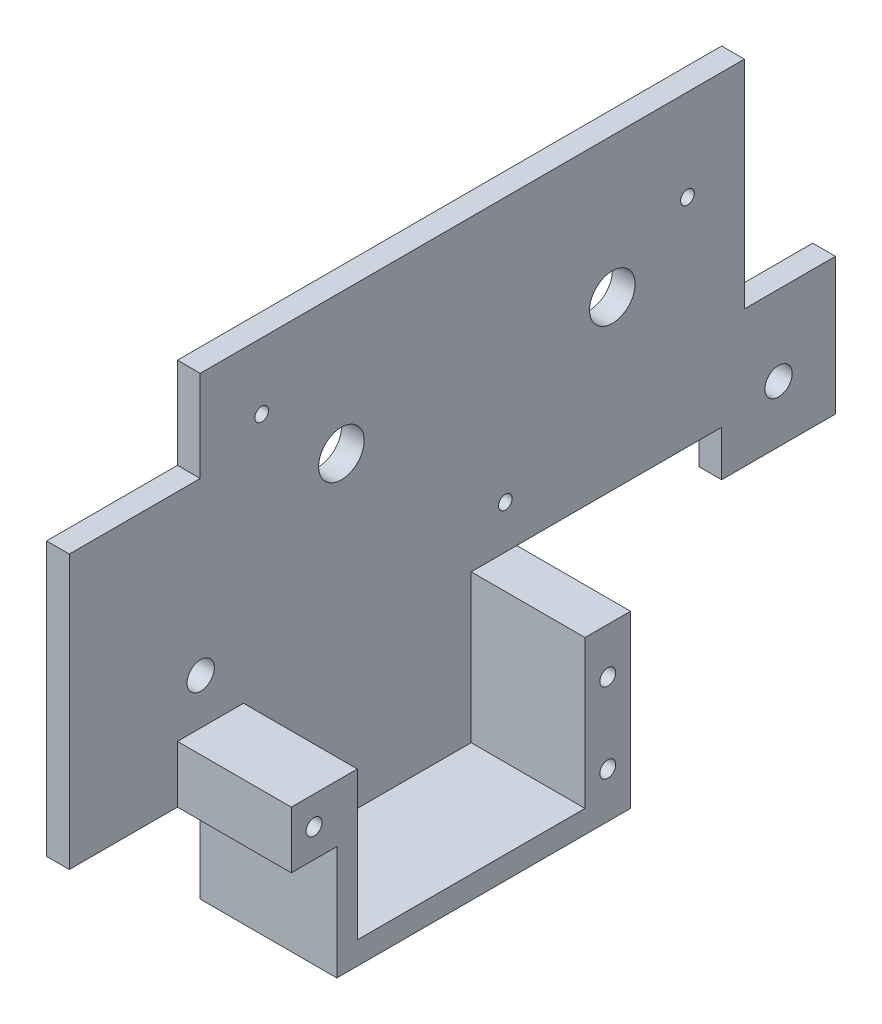
ISO-10303-21;
HEADER;
FILE_DESCRIPTION(('STEP AP214'),'2;1');
FILE_NAME('part.step','',(''),(''),'','','');
FILE_SCHEMA(('AUTOMOTIVE_DESIGN { 1 0 10303 214 1 1 1 1 }'));
ENDSEC;
DATA;
#1=APPLICATION_CONTEXT('core data for automotive mechanical design processes');
#2=APPLICATION_PROTOCOL_DEFINITION('international standard','automotive_design',2000,#1);
#3=PRODUCT_CONTEXT('',#1,'mechanical');
#4=PRODUCT('Part','Part','',(#3));
#5=PRODUCT_RELATED_PRODUCT_CATEGORY('part','',(#4));
#6=PRODUCT_DEFINITION_FORMATION('','',#4);
#7=PRODUCT_DEFINITION_CONTEXT('part definition',#1,'design');
#8=PRODUCT_DEFINITION('design','',#6,#7);
#9=PRODUCT_DEFINITION_SHAPE('','',#8);
#10=(LENGTH_UNIT() NAMED_UNIT(*) SI_UNIT(.MILLI.,.METRE.));
#11=(NAMED_UNIT(*) PLANE_ANGLE_UNIT() SI_UNIT($,.RADIAN.));
#12=(NAMED_UNIT(*) SI_UNIT($,.STERADIAN.) SOLID_ANGLE_UNIT());
#13=UNCERTAINTY_MEASURE_WITH_UNIT(LENGTH_MEASURE(1.E-05),#10,'distance_accuracy_value','');
#14=(GEOMETRIC_REPRESENTATION_CONTEXT(3) GLOBAL_UNCERTAINTY_ASSIGNED_CONTEXT((#13)) GLOBAL_UNIT_ASSIGNED_CONTEXT((#10,
#11,#12)) REPRESENTATION_CONTEXT('',''));
#15=CARTESIAN_POINT('',(0.,0.,0.));
#16=DIRECTION('',(0.,0.,1.));
#17=DIRECTION('',(1.,0.,0.));
#18=AXIS2_PLACEMENT_3D('',#15,#16,#17);
#19=CARTESIAN_POINT('',(1.,-13.5,0.));
#20=DIRECTION('',(0.,-1.,0.));
#21=DIRECTION('',(0.,0.,-1.));
#22=AXIS2_PLACEMENT_3D('',#19,#20,#21);
#23=PLANE('',#22);
#24=DIRECTION('',(0.,0.,1.));
#25=VECTOR('',#24,1.);
#26=CARTESIAN_POINT('',(1.,-13.5,0.));
#27=LINE('',#26,#25);
#28=CARTESIAN_POINT('',(1.,-13.5,0.));
#29=VERTEX_POINT('',#28);
#30=CARTESIAN_POINT('',(1.,-13.5,9.));
#31=VERTEX_POINT('',#30);
#32=EDGE_CURVE('E514',#29,#31,#27,.T.);
#33=ORIENTED_EDGE('',*,*,#32,.T.);
#34=DIRECTION('',(1.,0.,0.));
#35=VECTOR('',#34,1.);
#36=CARTESIAN_POINT('',(-16.6811270602439,-13.5,9.));
#37=LINE('',#36,#35);
#38=CARTESIAN_POINT('',(0.,-13.5,9.));
#39=VERTEX_POINT('',#38);
#40=EDGE_CURVE('E382',#39,#31,#37,.T.);
#41=ORIENTED_EDGE('',*,*,#40,.F.);
#42=DIRECTION('',(0.,0.,1.));
#43=VECTOR('',#42,1.);
#44=CARTESIAN_POINT('',(0.,-13.5,0.));
#45=LINE('',#44,#43);
#46=CARTESIAN_POINT('',(0.,-13.5,0.));
#47=VERTEX_POINT('',#46);
#48=EDGE_CURVE('E515',#47,#39,#45,.T.);
#49=ORIENTED_EDGE('',*,*,#48,.F.);
#50=DIRECTION('',(-1.,0.,0.));
#51=VECTOR('',#50,1.);
#52=CARTESIAN_POINT('',(1.,-13.5,0.));
#53=LINE('',#52,#51);
#54=EDGE_CURVE('E518',#29,#47,#53,.T.);
#55=ORIENTED_EDGE('',*,*,#54,.F.);
#56=EDGE_LOOP('',(#33,#41,#49,#55));
#57=FACE_BOUND('',#56,.T.);
#58=ADVANCED_FACE('F163',(#57),#23,.T.);
#59=CARTESIAN_POINT('',(-7.81024967590666,-9.5,0.));
#60=DIRECTION('',(0.,-1.,0.));
#61=DIRECTION('',(0.,0.,-1.));
#62=AXIS2_PLACEMENT_3D('',#59,#60,#61);
#63=PLANE('',#62);
#64=DIRECTION('',(1.,0.,0.));
#65=VECTOR('',#64,1.);
#66=CARTESIAN_POINT('',(-9.5524865872714,-9.5,-1.));
#67=LINE('',#66,#65);
#68=CARTESIAN_POINT('',(0.,-9.5,-1.));
#69=VERTEX_POINT('',#68);
#70=CARTESIAN_POINT('',(1.,-9.5,-1.));
#71=VERTEX_POINT('',#70);
#72=EDGE_CURVE('E434',#69,#71,#67,.T.);
#73=ORIENTED_EDGE('',*,*,#72,.T.);
#74=DIRECTION('',(0.,0.,-1.));
#75=VECTOR('',#74,1.);
#76=CARTESIAN_POINT('',(1.,-9.5,0.));
#77=LINE('',#76,#75);
#78=CARTESIAN_POINT('',(1.,-9.5,-5.));
#79=VERTEX_POINT('',#78);
#80=EDGE_CURVE('E479',#71,#79,#77,.T.);
#81=ORIENTED_EDGE('',*,*,#80,.T.);
#82=DIRECTION('',(1.,0.,0.));
#83=VECTOR('',#82,1.);
#84=CARTESIAN_POINT('',(-7.81024967590666,-9.5,-5.));
#85=LINE('',#84,#83);
#86=CARTESIAN_POINT('',(0.,-9.5,-5.));
#87=VERTEX_POINT('',#86);
#88=EDGE_CURVE('E487',#87,#79,#85,.T.);
#89=ORIENTED_EDGE('',*,*,#88,.F.);
#90=DIRECTION('',(0.,0.,1.));
#91=VECTOR('',#90,1.);
#92=CARTESIAN_POINT('',(0.,-9.5,0.));
#93=LINE('',#92,#91);
#94=EDGE_CURVE('E467',#87,#69,#93,.T.);
#95=ORIENTED_EDGE('',*,*,#94,.T.);
#96=EDGE_LOOP('',(#73,#81,#89,#95));
#97=FACE_BOUND('',#96,.T.);
#98=ADVANCED_FACE('F582',(#97),#63,.F.);
#99=CARTESIAN_POINT('',(1.,0.,0.));
#100=DIRECTION('',(0.,-1.,0.));
#101=DIRECTION('',(0.,0.,-1.));
#102=AXIS2_PLACEMENT_3D('',#99,#100,#101);
#103=PLANE('',#102);
#104=DIRECTION('',(0.,0.,1.));
#105=VECTOR('',#104,1.);
#106=CARTESIAN_POINT('',(0.,0.,0.));
#107=LINE('',#106,#105);
#108=CARTESIAN_POINT('',(0.,0.,-1.));
#109=VERTEX_POINT('',#108);
#110=CARTESIAN_POINT('',(0.,0.,22.9));
#111=VERTEX_POINT('',#110);
#112=EDGE_CURVE('E497',#109,#111,#107,.T.);
#113=ORIENTED_EDGE('',*,*,#112,.T.);
#114=DIRECTION('',(1.,0.,0.));
#115=VECTOR('',#114,1.);
#116=CARTESIAN_POINT('',(-0.5,0.,22.9));
#117=LINE('',#116,#115);
#118=CARTESIAN_POINT('',(1.,0.,22.9));
#119=VERTEX_POINT('',#118);
#120=EDGE_CURVE('E312',#111,#119,#117,.T.);
#121=ORIENTED_EDGE('',*,*,#120,.T.);
#122=DIRECTION('',(0.,0.,1.));
#123=VECTOR('',#122,1.);
#124=CARTESIAN_POINT('',(1.,0.,0.));
#125=LINE('',#124,#123);
#126=CARTESIAN_POINT('',(1.,0.,-1.));
#127=VERTEX_POINT('',#126);
#128=EDGE_CURVE('E512',#127,#119,#125,.T.);
#129=ORIENTED_EDGE('',*,*,#128,.F.);
#130=DIRECTION('',(1.,0.,0.));
#131=VECTOR('',#130,1.);
#132=CARTESIAN_POINT('',(-9.5524865872714,0.,-1.));
#133=LINE('',#132,#131);
#134=EDGE_CURVE('E431',#109,#127,#133,.T.);
#135=ORIENTED_EDGE('',*,*,#134,.F.);
#136=EDGE_LOOP('',(#113,#121,#129,#135));
#137=FACE_BOUND('',#136,.T.);
#138=ADVANCED_FACE('F165',(#137),#103,.F.);
#139=CARTESIAN_POINT('',(1.,0.,0.));
#140=DIRECTION('',(1.,0.,0.));
#141=DIRECTION('',(0.,0.,-1.));
#142=AXIS2_PLACEMENT_3D('',#139,#140,#141);
#143=PLANE('',#142);
#144=DIRECTION('',(0.,0.,1.));
#145=VECTOR('',#144,1.);
#146=CARTESIAN_POINT('',(1.,-13.5,0.));
#147=LINE('',#146,#145);
#148=CARTESIAN_POINT('',(1.,-13.5,21.));
#149=VERTEX_POINT('',#148);
#150=CARTESIAN_POINT('',(1.,-13.5,23.9));
#151=VERTEX_POINT('',#150);
#152=EDGE_CURVE('E178',#149,#151,#147,.T.);
#153=ORIENTED_EDGE('',*,*,#152,.F.);
#154=DIRECTION('',(0.,1.,0.));
#155=VECTOR('',#154,1.);
#156=CARTESIAN_POINT('',(1.,0.,21.));
#157=LINE('',#156,#155);
#158=CARTESIAN_POINT('',(1.,-20.,21.));
#159=VERTEX_POINT('',#158);
#160=EDGE_CURVE('E182',#159,#149,#157,.T.);
#161=ORIENTED_EDGE('',*,*,#160,.F.);
#162=DIRECTION('',(0.,0.,1.));
#163=VECTOR('',#162,1.);
#164=CARTESIAN_POINT('',(1.,-20.,0.));
#165=LINE('',#164,#163);
#166=CARTESIAN_POINT('',(1.,-20.,11.));
#167=VERTEX_POINT('',#166);
#168=EDGE_CURVE('E373',#167,#159,#165,.T.);
#169=ORIENTED_EDGE('',*,*,#168,.F.);
#170=DIRECTION('',(0.,1.,0.));
#171=VECTOR('',#170,1.);
#172=CARTESIAN_POINT('',(1.,0.,11.));
#173=LINE('',#172,#171);
#174=CARTESIAN_POINT('',(1.,-13.5,11.));
#175=VERTEX_POINT('',#174);
#176=EDGE_CURVE('E375',#167,#175,#173,.T.);
#177=ORIENTED_EDGE('',*,*,#176,.T.);
#178=DIRECTION('',(0.,0.,1.));
#179=VECTOR('',#178,1.);
#180=CARTESIAN_POINT('',(1.,-13.5,0.));
#181=LINE('',#180,#179);
#182=EDGE_CURVE('E348',#31,#175,#181,.T.);
#183=ORIENTED_EDGE('',*,*,#182,.F.);
#184=ORIENTED_EDGE('',*,*,#32,.F.);
#185=DIRECTION('',(0.,1.,0.));
#186=VECTOR('',#185,1.);
#187=CARTESIAN_POINT('',(1.,0.,0.));
#188=LINE('',#187,#186);
#189=CARTESIAN_POINT('',(1.,-15.5,0.));
#190=VERTEX_POINT('',#189);
#191=EDGE_CURVE('E481',#190,#29,#188,.T.);
#192=ORIENTED_EDGE('',*,*,#191,.F.);
#193=DIRECTION('',(0.,0.,-1.));
#194=VECTOR('',#193,1.);
#195=CARTESIAN_POINT('',(1.,-15.5,0.));
#196=LINE('',#195,#194);
#197=CARTESIAN_POINT('',(1.,-15.5,-5.));
#198=VERTEX_POINT('',#197);
#199=EDGE_CURVE('E484',#190,#198,#196,.T.);
#200=ORIENTED_EDGE('',*,*,#199,.T.);
#201=DIRECTION('',(0.,-1.,0.));
#202=VECTOR('',#201,1.);
#203=CARTESIAN_POINT('',(1.,0.,-5.));
#204=LINE('',#203,#202);
#205=EDGE_CURVE('E464',#79,#198,#204,.T.);
#206=ORIENTED_EDGE('',*,*,#205,.F.);
#207=ORIENTED_EDGE('',*,*,#80,.F.);
#208=DIRECTION('',(0.,-1.,0.));
#209=VECTOR('',#208,1.);
#210=CARTESIAN_POINT('',(1.,0.,-1.));
#211=LINE('',#210,#209);
#212=EDGE_CURVE('E415',#127,#71,#211,.T.);
#213=ORIENTED_EDGE('',*,*,#212,.F.);
#214=ORIENTED_EDGE('',*,*,#128,.T.);
#215=DIRECTION('',(0.,1.,0.));
#216=VECTOR('',#215,1.);
#217=CARTESIAN_POINT('',(1.,0.,22.9));
#218=LINE('',#217,#216);
#219=CARTESIAN_POINT('',(1.,-4.,22.9));
#220=VERTEX_POINT('',#219);
#221=EDGE_CURVE('E310',#220,#119,#218,.T.);
#222=ORIENTED_EDGE('',*,*,#221,.F.);
#223=DIRECTION('',(0.,0.,-1.));
#224=VECTOR('',#223,1.);
#225=CARTESIAN_POINT('',(1.,-4.,22.9));
#226=LINE('',#225,#224);
#227=CARTESIAN_POINT('',(1.,-4.,28.65));
#228=VERTEX_POINT('',#227);
#229=EDGE_CURVE('E302',#228,#220,#226,.T.);
#230=ORIENTED_EDGE('',*,*,#229,.F.);
#231=DIRECTION('',(0.,-1.,0.));
#232=VECTOR('',#231,1.);
#233=CARTESIAN_POINT('',(1.,0.,28.65));
#234=LINE('',#233,#232);
#235=CARTESIAN_POINT('',(1.,-16.,28.65));
#236=VERTEX_POINT('',#235);
#237=EDGE_CURVE('E308',#228,#236,#234,.T.);
#238=ORIENTED_EDGE('',*,*,#237,.T.);
#239=DIRECTION('',(0.,0.,1.));
#240=VECTOR('',#239,1.);
#241=CARTESIAN_POINT('',(1.,-16.,0.));
#242=LINE('',#241,#240);
#243=CARTESIAN_POINT('',(1.,-16.,23.9));
#244=VERTEX_POINT('',#243);
#245=EDGE_CURVE('E327',#244,#236,#242,.T.);
#246=ORIENTED_EDGE('',*,*,#245,.F.);
#247=DIRECTION('',(0.,1.,0.));
#248=VECTOR('',#247,1.);
#249=CARTESIAN_POINT('',(1.,0.,23.9));
#250=LINE('',#249,#248);
#251=EDGE_CURVE('E322',#244,#151,#250,.T.);
#252=ORIENTED_EDGE('',*,*,#251,.T.);
#253=EDGE_LOOP('',(#153,#161,#169,#177,#183,#184,#192,#200,#206,#207,#213,#214,#222,#230,#238,
#246,#252));
#254=FACE_BOUND('',#253,.T.);
#255=CARTESIAN_POINT('',(1.,-11.5,22.8806580456467));
#256=DIRECTION('',(-1.,0.,0.));
#257=DIRECTION('',(0.,0.,1.));
#258=AXIS2_PLACEMENT_3D('',#255,#256,#257);
#259=CIRCLE('',#258,0.6);
#260=CARTESIAN_POINT('',(1.,-11.5,23.4806580456467));
#261=VERTEX_POINT('',#260);
#262=EDGE_CURVE('E438',#261,#261,#259,.T.);
#263=ORIENTED_EDGE('',*,*,#262,.T.);
#264=EDGE_LOOP('',(#263));
#265=FACE_BOUND('',#264,.T.);
#266=CARTESIAN_POINT('',(1.,-6.15,16.7));
#267=DIRECTION('',(1.,0.,0.));
#268=DIRECTION('',(0.,0.,-1.));
#269=AXIS2_PLACEMENT_3D('',#266,#267,#268);
#270=CIRCLE('',#269,1.);
#271=CARTESIAN_POINT('',(1.,-6.15,15.7));
#272=VERTEX_POINT('',#271);
#273=EDGE_CURVE('E453',#272,#272,#270,.T.);
#274=ORIENTED_EDGE('',*,*,#273,.F.);
#275=EDGE_LOOP('',(#274));
#276=FACE_BOUND('',#275,.T.);
#277=CARTESIAN_POINT('',(1.,-6.15000000000001,4.8));
#278=DIRECTION('',(1.,0.,0.));
#279=DIRECTION('',(0.,0.,-1.));
#280=AXIS2_PLACEMENT_3D('',#277,#278,#279);
#281=CIRCLE('',#280,1.);
#282=CARTESIAN_POINT('',(1.,-6.15000000000001,3.8));
#283=VERTEX_POINT('',#282);
#284=EDGE_CURVE('E456',#283,#283,#281,.T.);
#285=ORIENTED_EDGE('',*,*,#284,.F.);
#286=EDGE_LOOP('',(#285));
#287=FACE_BOUND('',#286,.T.);
#288=CARTESIAN_POINT('',(1.,-13.,-2.5));
#289=DIRECTION('',(1.,0.,0.));
#290=DIRECTION('',(0.,0.,-1.));
#291=AXIS2_PLACEMENT_3D('',#288,#289,#290);
#292=CIRCLE('',#291,0.6);
#293=CARTESIAN_POINT('',(1.,-13.,-3.1));
#294=VERTEX_POINT('',#293);
#295=EDGE_CURVE('E452',#294,#294,#292,.T.);
#296=ORIENTED_EDGE('',*,*,#295,.F.);
#297=EDGE_LOOP('',(#296));
#298=FACE_BOUND('',#297,.T.);
#299=CARTESIAN_POINT('',(1.,-4.,1.5));
#300=DIRECTION('',(1.,0.,0.));
#301=DIRECTION('',(0.,0.,-1.));
#302=AXIS2_PLACEMENT_3D('',#299,#300,#301);
#303=CIRCLE('',#302,0.3);
#304=CARTESIAN_POINT('',(1.,-4.,1.2));
#305=VERTEX_POINT('',#304);
#306=EDGE_CURVE('E498',#305,#305,#303,.T.);
#307=ORIENTED_EDGE('',*,*,#306,.F.);
#308=EDGE_LOOP('',(#307));
#309=FACE_BOUND('',#308,.T.);
#310=CARTESIAN_POINT('',(1.,-11.6,9.5));
#311=DIRECTION('',(1.,0.,0.));
#312=DIRECTION('',(0.,0.,-1.));
#313=AXIS2_PLACEMENT_3D('',#310,#311,#312);
#314=CIRCLE('',#313,0.3);
#315=CARTESIAN_POINT('',(1.,-11.6,9.2));
#316=VERTEX_POINT('',#315);
#317=EDGE_CURVE('E501',#316,#316,#314,.T.);
#318=ORIENTED_EDGE('',*,*,#317,.F.);
#319=EDGE_LOOP('',(#318));
#320=FACE_BOUND('',#319,.T.);
#321=CARTESIAN_POINT('',(1.,-2.9,20.2));
#322=DIRECTION('',(1.,0.,0.));
#323=DIRECTION('',(0.,0.,-1.));
#324=AXIS2_PLACEMENT_3D('',#321,#322,#323);
#325=CIRCLE('',#324,0.3);
#326=CARTESIAN_POINT('',(1.,-2.9,19.9));
#327=VERTEX_POINT('',#326);
#328=EDGE_CURVE('E507',#327,#327,#325,.T.);
#329=ORIENTED_EDGE('',*,*,#328,.F.);
#330=EDGE_LOOP('',(#329));
#331=FACE_BOUND('',#330,.T.);
#332=ADVANCED_FACE('F304',(#254,#265,#276,#287,#298,#309,#320,#331),#143,.T.);
#333=CARTESIAN_POINT('',(0.,0.,0.));
#334=DIRECTION('',(1.,0.,0.));
#335=DIRECTION('',(0.,0.,-1.));
#336=AXIS2_PLACEMENT_3D('',#333,#334,#335);
#337=PLANE('',#336);
#338=DIRECTION('',(0.,1.,0.));
#339=VECTOR('',#338,1.);
#340=CARTESIAN_POINT('',(0.,0.,28.65));
#341=LINE('',#340,#339);
#342=CARTESIAN_POINT('',(0.,-16.,28.65));
#343=VERTEX_POINT('',#342);
#344=CARTESIAN_POINT('',(0.,-4.,28.65));
#345=VERTEX_POINT('',#344);
#346=EDGE_CURVE('E332',#343,#345,#341,.T.);
#347=ORIENTED_EDGE('',*,*,#346,.T.);
#348=DIRECTION('',(0.,0.,-1.));
#349=VECTOR('',#348,1.);
#350=CARTESIAN_POINT('',(0.,-3.99999999999999,0.));
#351=LINE('',#350,#349);
#352=CARTESIAN_POINT('',(0.,-4.,22.9));
#353=VERTEX_POINT('',#352);
#354=EDGE_CURVE('E171',#345,#353,#351,.T.);
#355=ORIENTED_EDGE('',*,*,#354,.T.);
#356=DIRECTION('',(0.,1.,0.));
#357=VECTOR('',#356,1.);
#358=CARTESIAN_POINT('',(0.,0.,22.9));
#359=LINE('',#358,#357);
#360=EDGE_CURVE('E12',#353,#111,#359,.T.);
#361=ORIENTED_EDGE('',*,*,#360,.T.);
#362=ORIENTED_EDGE('',*,*,#112,.F.);
#363=DIRECTION('',(0.,1.,0.));
#364=VECTOR('',#363,1.);
#365=CARTESIAN_POINT('',(0.,0.,-1.));
#366=LINE('',#365,#364);
#367=EDGE_CURVE('E427',#69,#109,#366,.T.);
#368=ORIENTED_EDGE('',*,*,#367,.F.);
#369=ORIENTED_EDGE('',*,*,#94,.F.);
#370=DIRECTION('',(0.,1.,0.));
#371=VECTOR('',#370,1.);
#372=CARTESIAN_POINT('',(0.,0.,-5.));
#373=LINE('',#372,#371);
#374=CARTESIAN_POINT('',(0.,-15.5,-5.));
#375=VERTEX_POINT('',#374);
#376=EDGE_CURVE('E475',#375,#87,#373,.T.);
#377=ORIENTED_EDGE('',*,*,#376,.F.);
#378=DIRECTION('',(0.,0.,1.));
#379=VECTOR('',#378,1.);
#380=CARTESIAN_POINT('',(0.,-15.5,0.));
#381=LINE('',#380,#379);
#382=CARTESIAN_POINT('',(0.,-15.5,0.));
#383=VERTEX_POINT('',#382);
#384=EDGE_CURVE('E472',#375,#383,#381,.T.);
#385=ORIENTED_EDGE('',*,*,#384,.T.);
#386=DIRECTION('',(0.,-1.,0.));
#387=VECTOR('',#386,1.);
#388=CARTESIAN_POINT('',(0.,0.,0.));
#389=LINE('',#388,#387);
#390=EDGE_CURVE('E469',#47,#383,#389,.T.);
#391=ORIENTED_EDGE('',*,*,#390,.F.);
#392=ORIENTED_EDGE('',*,*,#48,.T.);
#393=DIRECTION('',(0.,1.,0.));
#394=VECTOR('',#393,1.);
#395=CARTESIAN_POINT('',(0.,0.,9.));
#396=LINE('',#395,#394);
#397=CARTESIAN_POINT('',(0.,-21.,9.));
#398=VERTEX_POINT('',#397);
#399=EDGE_CURVE('E406',#398,#39,#396,.T.);
#400=ORIENTED_EDGE('',*,*,#399,.F.);
#401=DIRECTION('',(0.,0.,-1.));
#402=VECTOR('',#401,1.);
#403=CARTESIAN_POINT('',(0.,-21.,0.));
#404=LINE('',#403,#402);
#405=CARTESIAN_POINT('',(0.,-21.,21.9));
#406=VERTEX_POINT('',#405);
#407=EDGE_CURVE('E403',#406,#398,#404,.T.);
#408=ORIENTED_EDGE('',*,*,#407,.F.);
#409=DIRECTION('',(0.,-1.,0.));
#410=VECTOR('',#409,1.);
#411=CARTESIAN_POINT('',(0.,0.,21.9));
#412=LINE('',#411,#410);
#413=CARTESIAN_POINT('',(0.,-16.,21.9));
#414=VERTEX_POINT('',#413);
#415=EDGE_CURVE('E399',#414,#406,#412,.T.);
#416=ORIENTED_EDGE('',*,*,#415,.F.);
#417=DIRECTION('',(0.,0.,-1.));
#418=VECTOR('',#417,1.);
#419=CARTESIAN_POINT('',(0.,-16.,0.));
#420=LINE('',#419,#418);
#421=EDGE_CURVE('E396',#343,#414,#420,.T.);
#422=ORIENTED_EDGE('',*,*,#421,.F.);
#423=EDGE_LOOP('',(#347,#355,#361,#362,#368,#369,#377,#385,#391,#392,#400,#408,#416,#422));
#424=FACE_BOUND('',#423,.T.);
#425=CARTESIAN_POINT('',(0.,-11.5,22.8806580456467));
#426=DIRECTION('',(-1.,0.,0.));
#427=DIRECTION('',(0.,0.,1.));
#428=AXIS2_PLACEMENT_3D('',#425,#426,#427);
#429=CIRCLE('',#428,0.6);
#430=CARTESIAN_POINT('',(0.,-11.5,23.4806580456467));
#431=VERTEX_POINT('',#430);
#432=EDGE_CURVE('E430',#431,#431,#429,.T.);
#433=ORIENTED_EDGE('',*,*,#432,.F.);
#434=EDGE_LOOP('',(#433));
#435=FACE_BOUND('',#434,.T.);
#436=CARTESIAN_POINT('',(0.,-6.15,16.7));
#437=DIRECTION('',(1.,0.,0.));
#438=DIRECTION('',(0.,0.,-1.));
#439=AXIS2_PLACEMENT_3D('',#436,#437,#438);
#440=CIRCLE('',#439,1.);
#441=CARTESIAN_POINT('',(0.,-6.15,15.7));
#442=VERTEX_POINT('',#441);
#443=EDGE_CURVE('E449',#442,#442,#440,.T.);
#444=ORIENTED_EDGE('',*,*,#443,.T.);
#445=EDGE_LOOP('',(#444));
#446=FACE_BOUND('',#445,.T.);
#447=CARTESIAN_POINT('',(0.,-6.15000000000001,4.8));
#448=DIRECTION('',(1.,0.,0.));
#449=DIRECTION('',(0.,0.,-1.));
#450=AXIS2_PLACEMENT_3D('',#447,#448,#449);
#451=CIRCLE('',#450,1.);
#452=CARTESIAN_POINT('',(0.,-6.15000000000001,3.8));
#453=VERTEX_POINT('',#452);
#454=EDGE_CURVE('E446',#453,#453,#451,.T.);
#455=ORIENTED_EDGE('',*,*,#454,.T.);
#456=EDGE_LOOP('',(#455));
#457=FACE_BOUND('',#456,.T.);
#458=CARTESIAN_POINT('',(0.,-13.,-2.5));
#459=DIRECTION('',(1.,0.,0.));
#460=DIRECTION('',(0.,0.,-1.));
#461=AXIS2_PLACEMENT_3D('',#458,#459,#460);
#462=CIRCLE('',#461,0.6);
#463=CARTESIAN_POINT('',(0.,-13.,-3.1));
#464=VERTEX_POINT('',#463);
#465=EDGE_CURVE('E461',#464,#464,#462,.T.);
#466=ORIENTED_EDGE('',*,*,#465,.T.);
#467=EDGE_LOOP('',(#466));
#468=FACE_BOUND('',#467,.T.);
#469=CARTESIAN_POINT('',(0.,-4.,1.5));
#470=DIRECTION('',(1.,0.,0.));
#471=DIRECTION('',(0.,0.,-1.));
#472=AXIS2_PLACEMENT_3D('',#469,#470,#471);
#473=CIRCLE('',#472,0.3);
#474=CARTESIAN_POINT('',(0.,-4.,1.2));
#475=VERTEX_POINT('',#474);
#476=EDGE_CURVE('E494',#475,#475,#473,.T.);
#477=ORIENTED_EDGE('',*,*,#476,.T.);
#478=EDGE_LOOP('',(#477));
#479=FACE_BOUND('',#478,.T.);
#480=CARTESIAN_POINT('',(0.,-11.6,9.5));
#481=DIRECTION('',(1.,0.,0.));
#482=DIRECTION('',(0.,0.,-1.));
#483=AXIS2_PLACEMENT_3D('',#480,#481,#482);
#484=CIRCLE('',#483,0.3);
#485=CARTESIAN_POINT('',(0.,-11.6,9.2));
#486=VERTEX_POINT('',#485);
#487=EDGE_CURVE('E504',#486,#486,#484,.T.);
#488=ORIENTED_EDGE('',*,*,#487,.T.);
#489=EDGE_LOOP('',(#488));
#490=FACE_BOUND('',#489,.T.);
#491=CARTESIAN_POINT('',(0.,-2.9,20.2));
#492=DIRECTION('',(1.,0.,0.));
#493=DIRECTION('',(0.,0.,-1.));
#494=AXIS2_PLACEMENT_3D('',#491,#492,#493);
#495=CIRCLE('',#494,0.3);
#496=CARTESIAN_POINT('',(0.,-2.9,19.9));
#497=VERTEX_POINT('',#496);
#498=EDGE_CURVE('E477',#497,#497,#495,.T.);
#499=ORIENTED_EDGE('',*,*,#498,.T.);
#500=EDGE_LOOP('',(#499));
#501=FACE_BOUND('',#500,.T.);
#502=CARTESIAN_POINT('',(0.,-14.75,22.9));
#503=DIRECTION('',(1.,0.,0.));
#504=DIRECTION('',(0.,0.,-1.));
#505=AXIS2_PLACEMENT_3D('',#502,#503,#504);
#506=CIRCLE('',#505,0.350000000000001);
#507=CARTESIAN_POINT('',(0.,-14.75,22.55));
#508=VERTEX_POINT('',#507);
#509=EDGE_CURVE('E408',#508,#508,#506,.F.);
#510=ORIENTED_EDGE('',*,*,#509,.F.);
#511=EDGE_LOOP('',(#510));
#512=FACE_BOUND('',#511,.T.);
#513=CARTESIAN_POINT('',(0.,-19.,10.));
#514=DIRECTION('',(1.,0.,0.));
#515=DIRECTION('',(0.,0.,-1.));
#516=AXIS2_PLACEMENT_3D('',#513,#514,#515);
#517=CIRCLE('',#516,0.349999999999999);
#518=CARTESIAN_POINT('',(0.,-19.,9.65));
#519=VERTEX_POINT('',#518);
#520=EDGE_CURVE('E411',#519,#519,#517,.F.);
#521=ORIENTED_EDGE('',*,*,#520,.F.);
#522=EDGE_LOOP('',(#521));
#523=FACE_BOUND('',#522,.T.);
#524=CARTESIAN_POINT('',(0.,-15.5,10.));
#525=DIRECTION('',(1.,0.,0.));
#526=DIRECTION('',(0.,0.,-1.));
#527=AXIS2_PLACEMENT_3D('',#524,#525,#526);
#528=CIRCLE('',#527,0.349999999999999);
#529=CARTESIAN_POINT('',(0.,-15.5,9.65));
#530=VERTEX_POINT('',#529);
#531=EDGE_CURVE('E412',#530,#530,#528,.F.);
#532=ORIENTED_EDGE('',*,*,#531,.F.);
#533=EDGE_LOOP('',(#532));
#534=FACE_BOUND('',#533,.T.);
#535=ADVANCED_FACE('F525',(#424,#435,#446,#457,#468,#479,#490,#501,#512,#523,#534),#337,.F.);
#536=CARTESIAN_POINT('',(0.,-2.9,20.2));
#537=DIRECTION('',(1.,0.,0.));
#538=DIRECTION('',(0.,0.,-1.));
#539=AXIS2_PLACEMENT_3D('',#536,#537,#538);
#540=CYLINDRICAL_SURFACE('',#539,0.3);
#541=ORIENTED_EDGE('',*,*,#498,.F.);
#542=EDGE_LOOP('',(#541));
#543=FACE_BOUND('',#542,.T.);
#544=ORIENTED_EDGE('',*,*,#328,.T.);
#545=EDGE_LOOP('',(#544));
#546=FACE_BOUND('',#545,.T.);
#547=ADVANCED_FACE('F611',(#543,#546),#540,.F.);
#548=CARTESIAN_POINT('',(0.,-11.6,9.5));
#549=DIRECTION('',(1.,0.,0.));
#550=DIRECTION('',(0.,0.,-1.));
#551=AXIS2_PLACEMENT_3D('',#548,#549,#550);
#552=CYLINDRICAL_SURFACE('',#551,0.3);
#553=ORIENTED_EDGE('',*,*,#487,.F.);
#554=EDGE_LOOP('',(#553));
#555=FACE_BOUND('',#554,.T.);
#556=ORIENTED_EDGE('',*,*,#317,.T.);
#557=EDGE_LOOP('',(#556));
#558=FACE_BOUND('',#557,.T.);
#559=ADVANCED_FACE('F616',(#555,#558),#552,.F.);
#560=CARTESIAN_POINT('',(0.,-4.,1.5));
#561=DIRECTION('',(1.,0.,0.));
#562=DIRECTION('',(0.,0.,-1.));
#563=AXIS2_PLACEMENT_3D('',#560,#561,#562);
#564=CYLINDRICAL_SURFACE('',#563,0.3);
#565=ORIENTED_EDGE('',*,*,#476,.F.);
#566=EDGE_LOOP('',(#565));
#567=FACE_BOUND('',#566,.T.);
#568=ORIENTED_EDGE('',*,*,#306,.T.);
#569=EDGE_LOOP('',(#568));
#570=FACE_BOUND('',#569,.T.);
#571=ADVANCED_FACE('F620',(#567,#570),#564,.F.);
#572=CARTESIAN_POINT('',(-7.81024967590666,0.,0.));
#573=DIRECTION('',(0.,0.,-1.));
#574=DIRECTION('',(0.,1.,0.));
#575=AXIS2_PLACEMENT_3D('',#572,#573,#574);
#576=PLANE('',#575);
#577=ORIENTED_EDGE('',*,*,#191,.T.);
#578=ORIENTED_EDGE('',*,*,#54,.T.);
#579=ORIENTED_EDGE('',*,*,#390,.T.);
#580=DIRECTION('',(1.,0.,0.));
#581=VECTOR('',#580,1.);
#582=CARTESIAN_POINT('',(-7.81024967590666,-15.5,0.));
#583=LINE('',#582,#581);
#584=EDGE_CURVE('E490',#383,#190,#583,.T.);
#585=ORIENTED_EDGE('',*,*,#584,.T.);
#586=EDGE_LOOP('',(#577,#578,#579,#585));
#587=FACE_BOUND('',#586,.T.);
#588=ADVANCED_FACE('F567',(#587),#576,.F.);
#589=CARTESIAN_POINT('',(-7.81024967590666,-15.5,0.));
#590=DIRECTION('',(0.,-1.,0.));
#591=DIRECTION('',(0.,0.,-1.));
#592=AXIS2_PLACEMENT_3D('',#589,#590,#591);
#593=PLANE('',#592);
#594=ORIENTED_EDGE('',*,*,#384,.F.);
#595=DIRECTION('',(1.,0.,0.));
#596=VECTOR('',#595,1.);
#597=CARTESIAN_POINT('',(-7.81024967590666,-15.5,-5.));
#598=LINE('',#597,#596);
#599=EDGE_CURVE('E470',#375,#198,#598,.T.);
#600=ORIENTED_EDGE('',*,*,#599,.T.);
#601=ORIENTED_EDGE('',*,*,#199,.F.);
#602=ORIENTED_EDGE('',*,*,#584,.F.);
#603=EDGE_LOOP('',(#594,#600,#601,#602));
#604=FACE_BOUND('',#603,.T.);
#605=ADVANCED_FACE('F572',(#604),#593,.T.);
#606=CARTESIAN_POINT('',(-7.81024967590666,0.,-5.));
#607=DIRECTION('',(0.,0.,1.));
#608=DIRECTION('',(1.,0.,0.));
#609=AXIS2_PLACEMENT_3D('',#606,#607,#608);
#610=PLANE('',#609);
#611=ORIENTED_EDGE('',*,*,#376,.T.);
#612=ORIENTED_EDGE('',*,*,#88,.T.);
#613=ORIENTED_EDGE('',*,*,#205,.T.);
#614=ORIENTED_EDGE('',*,*,#599,.F.);
#615=EDGE_LOOP('',(#611,#612,#613,#614));
#616=FACE_BOUND('',#615,.T.);
#617=ADVANCED_FACE('F578',(#616),#610,.F.);
#618=CARTESIAN_POINT('',(0.,-13.,-2.5));
#619=DIRECTION('',(1.,0.,0.));
#620=DIRECTION('',(0.,0.,-1.));
#621=AXIS2_PLACEMENT_3D('',#618,#619,#620);
#622=CYLINDRICAL_SURFACE('',#621,0.6);
#623=ORIENTED_EDGE('',*,*,#465,.F.);
#624=EDGE_LOOP('',(#623));
#625=FACE_BOUND('',#624,.T.);
#626=ORIENTED_EDGE('',*,*,#295,.T.);
#627=EDGE_LOOP('',(#626));
#628=FACE_BOUND('',#627,.T.);
#629=ADVANCED_FACE('F626',(#625,#628),#622,.F.);
#630=CARTESIAN_POINT('',(0.,-6.15000000000001,4.8));
#631=DIRECTION('',(1.,0.,0.));
#632=DIRECTION('',(0.,0.,-1.));
#633=AXIS2_PLACEMENT_3D('',#630,#631,#632);
#634=CYLINDRICAL_SURFACE('',#633,1.);
#635=ORIENTED_EDGE('',*,*,#454,.F.);
#636=EDGE_LOOP('',(#635));
#637=FACE_BOUND('',#636,.T.);
#638=ORIENTED_EDGE('',*,*,#284,.T.);
#639=EDGE_LOOP('',(#638));
#640=FACE_BOUND('',#639,.T.);
#641=ADVANCED_FACE('F600',(#637,#640),#634,.F.);
#642=CARTESIAN_POINT('',(0.,-6.15,16.7));
#643=DIRECTION('',(1.,0.,0.));
#644=DIRECTION('',(0.,0.,-1.));
#645=AXIS2_PLACEMENT_3D('',#642,#643,#644);
#646=CYLINDRICAL_SURFACE('',#645,1.);
#647=ORIENTED_EDGE('',*,*,#443,.F.);
#648=EDGE_LOOP('',(#647));
#649=FACE_BOUND('',#648,.T.);
#650=ORIENTED_EDGE('',*,*,#273,.T.);
#651=EDGE_LOOP('',(#650));
#652=FACE_BOUND('',#651,.T.);
#653=ADVANCED_FACE('F592',(#649,#652),#646,.F.);
#654=CARTESIAN_POINT('',(-0.5,0.,22.9));
#655=DIRECTION('',(0.,0.,-1.));
#656=DIRECTION('',(-1.,0.,0.));
#657=AXIS2_PLACEMENT_3D('',#654,#655,#656);
#658=PLANE('',#657);
#659=DIRECTION('',(1.,0.,0.));
#660=VECTOR('',#659,1.);
#661=CARTESIAN_POINT('',(-0.5,-4.,22.9));
#662=LINE('',#661,#660);
#663=EDGE_CURVE('E444',#353,#220,#662,.T.);
#664=ORIENTED_EDGE('',*,*,#663,.T.);
#665=ORIENTED_EDGE('',*,*,#221,.T.);
#666=ORIENTED_EDGE('',*,*,#120,.F.);
#667=ORIENTED_EDGE('',*,*,#360,.F.);
#668=EDGE_LOOP('',(#664,#665,#666,#667));
#669=FACE_BOUND('',#668,.T.);
#670=ADVANCED_FACE('F590',(#669),#658,.F.);
#671=CARTESIAN_POINT('',(-0.5,-4.,22.9));
#672=DIRECTION('',(0.,-1.,0.));
#673=DIRECTION('',(0.,0.,-1.));
#674=AXIS2_PLACEMENT_3D('',#671,#672,#673);
#675=PLANE('',#674);
#676=ORIENTED_EDGE('',*,*,#229,.T.);
#677=ORIENTED_EDGE('',*,*,#663,.F.);
#678=ORIENTED_EDGE('',*,*,#354,.F.);
#679=DIRECTION('',(1.,0.,0.));
#680=VECTOR('',#679,1.);
#681=CARTESIAN_POINT('',(-12.9059094991403,-4.,28.65));
#682=LINE('',#681,#680);
#683=EDGE_CURVE('E315',#345,#228,#682,.T.);
#684=ORIENTED_EDGE('',*,*,#683,.T.);
#685=EDGE_LOOP('',(#676,#677,#678,#684));
#686=FACE_BOUND('',#685,.T.);
#687=ADVANCED_FACE('F316',(#686),#675,.F.);
#688=CARTESIAN_POINT('',(1.,-11.5,22.8806580456467));
#689=DIRECTION('',(-1.,0.,0.));
#690=DIRECTION('',(0.,0.,1.));
#691=AXIS2_PLACEMENT_3D('',#688,#689,#690);
#692=CYLINDRICAL_SURFACE('',#691,0.6);
#693=ORIENTED_EDGE('',*,*,#262,.F.);
#694=EDGE_LOOP('',(#693));
#695=FACE_BOUND('',#694,.T.);
#696=ORIENTED_EDGE('',*,*,#432,.T.);
#697=EDGE_LOOP('',(#696));
#698=FACE_BOUND('',#697,.T.);
#699=ADVANCED_FACE('F598',(#695,#698),#692,.F.);
#700=CARTESIAN_POINT('',(-9.5524865872714,0.,-1.));
#701=DIRECTION('',(0.,0.,1.));
#702=DIRECTION('',(0.,-1.,0.));
#703=AXIS2_PLACEMENT_3D('',#700,#701,#702);
#704=PLANE('',#703);
#705=ORIENTED_EDGE('',*,*,#72,.F.);
#706=ORIENTED_EDGE('',*,*,#367,.T.);
#707=ORIENTED_EDGE('',*,*,#134,.T.);
#708=ORIENTED_EDGE('',*,*,#212,.T.);
#709=EDGE_LOOP('',(#705,#706,#707,#708));
#710=FACE_BOUND('',#709,.T.);
#711=ADVANCED_FACE('F586',(#710),#704,.F.);
#712=CARTESIAN_POINT('',(-16.6811270602439,-15.5,10.));
#713=DIRECTION('',(1.,0.,0.));
#714=DIRECTION('',(0.,0.,-1.));
#715=AXIS2_PLACEMENT_3D('',#712,#713,#714);
#716=CYLINDRICAL_SURFACE('',#715,0.349999999999999);
#717=ORIENTED_EDGE('',*,*,#531,.T.);
#718=EDGE_LOOP('',(#717));
#719=FACE_BOUND('',#718,.T.);
#720=CARTESIAN_POINT('',(6.,-15.5,10.));
#721=DIRECTION('',(1.,0.,0.));
#722=DIRECTION('',(0.,0.,-1.));
#723=AXIS2_PLACEMENT_3D('',#720,#721,#722);
#724=CIRCLE('',#723,0.349999999999999);
#725=CARTESIAN_POINT('',(6.,-15.5,9.65));
#726=VERTEX_POINT('',#725);
#727=EDGE_CURVE('E341',#726,#726,#724,.T.);
#728=ORIENTED_EDGE('',*,*,#727,.T.);
#729=EDGE_LOOP('',(#728));
#730=FACE_BOUND('',#729,.T.);
#731=ADVANCED_FACE('F671',(#719,#730),#716,.F.);
#732=CARTESIAN_POINT('',(-16.6811270602439,-14.75,22.9));
#733=DIRECTION('',(1.,0.,0.));
#734=DIRECTION('',(0.,0.,-1.));
#735=AXIS2_PLACEMENT_3D('',#732,#733,#734);
#736=CYLINDRICAL_SURFACE('',#735,0.350000000000001);
#737=ORIENTED_EDGE('',*,*,#509,.T.);
#738=EDGE_LOOP('',(#737));
#739=FACE_BOUND('',#738,.T.);
#740=CARTESIAN_POINT('',(6.,-14.75,22.9));
#741=DIRECTION('',(1.,0.,0.));
#742=DIRECTION('',(0.,0.,-1.));
#743=AXIS2_PLACEMENT_3D('',#740,#741,#742);
#744=CIRCLE('',#743,0.350000000000001);
#745=CARTESIAN_POINT('',(6.,-14.75,22.55));
#746=VERTEX_POINT('',#745);
#747=EDGE_CURVE('E338',#746,#746,#744,.T.);
#748=ORIENTED_EDGE('',*,*,#747,.T.);
#749=EDGE_LOOP('',(#748));
#750=FACE_BOUND('',#749,.T.);
#751=ADVANCED_FACE('F674',(#739,#750),#736,.F.);
#752=CARTESIAN_POINT('',(-16.6811270602439,0.,23.9));
#753=DIRECTION('',(0.,0.,1.));
#754=DIRECTION('',(1.,0.,0.));
#755=AXIS2_PLACEMENT_3D('',#752,#753,#754);
#756=PLANE('',#755);
#757=ORIENTED_EDGE('',*,*,#251,.F.);
#758=DIRECTION('',(1.,0.,0.));
#759=VECTOR('',#758,1.);
#760=CARTESIAN_POINT('',(-16.6811270602439,-16.,23.9));
#761=LINE('',#760,#759);
#762=CARTESIAN_POINT('',(6.,-16.,23.9));
#763=VERTEX_POINT('',#762);
#764=EDGE_CURVE('E421',#244,#763,#761,.T.);
#765=ORIENTED_EDGE('',*,*,#764,.T.);
#766=DIRECTION('',(0.,1.,0.));
#767=VECTOR('',#766,1.);
#768=CARTESIAN_POINT('',(6.,0.,23.9));
#769=LINE('',#768,#767);
#770=CARTESIAN_POINT('',(6.,-13.5,23.9));
#771=VERTEX_POINT('',#770);
#772=EDGE_CURVE('E344',#763,#771,#769,.T.);
#773=ORIENTED_EDGE('',*,*,#772,.T.);
#774=DIRECTION('',(-1.,0.,0.));
#775=VECTOR('',#774,1.);
#776=CARTESIAN_POINT('',(6.,-13.5,23.9));
#777=LINE('',#776,#775);
#778=EDGE_CURVE('E370',#771,#151,#777,.T.);
#779=ORIENTED_EDGE('',*,*,#778,.T.);
#780=EDGE_LOOP('',(#757,#765,#773,#779));
#781=FACE_BOUND('',#780,.T.);
#782=ADVANCED_FACE('F534',(#781),#756,.T.);
#783=CARTESIAN_POINT('',(-16.6811270602439,-16.,0.));
#784=DIRECTION('',(0.,1.,0.));
#785=DIRECTION('',(0.,0.,1.));
#786=AXIS2_PLACEMENT_3D('',#783,#784,#785);
#787=PLANE('',#786);
#788=ORIENTED_EDGE('',*,*,#764,.F.);
#789=ORIENTED_EDGE('',*,*,#245,.T.);
#790=DIRECTION('',(1.,0.,0.));
#791=VECTOR('',#790,1.);
#792=CARTESIAN_POINT('',(-12.9059094991403,-16.,28.65));
#793=LINE('',#792,#791);
#794=EDGE_CURVE('E321',#343,#236,#793,.T.);
#795=ORIENTED_EDGE('',*,*,#794,.F.);
#796=ORIENTED_EDGE('',*,*,#421,.T.);
#797=DIRECTION('',(1.,0.,0.));
#798=VECTOR('',#797,1.);
#799=CARTESIAN_POINT('',(-16.6811270602439,-16.,21.9));
#800=LINE('',#799,#798);
#801=CARTESIAN_POINT('',(6.,-16.,21.9));
#802=VERTEX_POINT('',#801);
#803=EDGE_CURVE('E419',#414,#802,#800,.T.);
#804=ORIENTED_EDGE('',*,*,#803,.T.);
#805=DIRECTION('',(0.,0.,-1.));
#806=VECTOR('',#805,1.);
#807=CARTESIAN_POINT('',(6.,-16.,0.));
#808=LINE('',#807,#806);
#809=EDGE_CURVE('E367',#763,#802,#808,.T.);
#810=ORIENTED_EDGE('',*,*,#809,.F.);
#811=EDGE_LOOP('',(#788,#789,#795,#796,#804,#810));
#812=FACE_BOUND('',#811,.T.);
#813=ADVANCED_FACE('F530',(#812),#787,.F.);
#814=CARTESIAN_POINT('',(-16.6811270602439,0.,21.9));
#815=DIRECTION('',(0.,0.,-1.));
#816=DIRECTION('',(-1.,0.,0.));
#817=AXIS2_PLACEMENT_3D('',#814,#815,#816);
#818=PLANE('',#817);
#819=ORIENTED_EDGE('',*,*,#803,.F.);
#820=ORIENTED_EDGE('',*,*,#415,.T.);
#821=DIRECTION('',(1.,0.,0.));
#822=VECTOR('',#821,1.);
#823=CARTESIAN_POINT('',(-16.6811270602439,-21.,21.9));
#824=LINE('',#823,#822);
#825=CARTESIAN_POINT('',(6.,-21.,21.9));
#826=VERTEX_POINT('',#825);
#827=EDGE_CURVE('E417',#406,#826,#824,.T.);
#828=ORIENTED_EDGE('',*,*,#827,.T.);
#829=DIRECTION('',(0.,-1.,0.));
#830=VECTOR('',#829,1.);
#831=CARTESIAN_POINT('',(6.,0.,21.9));
#832=LINE('',#831,#830);
#833=EDGE_CURVE('E364',#802,#826,#832,.T.);
#834=ORIENTED_EDGE('',*,*,#833,.F.);
#835=EDGE_LOOP('',(#819,#820,#828,#834));
#836=FACE_BOUND('',#835,.T.);
#837=ADVANCED_FACE('F702',(#836),#818,.F.);
#838=CARTESIAN_POINT('',(-16.6811270602439,-21.,0.));
#839=DIRECTION('',(0.,1.,0.));
#840=DIRECTION('',(0.,0.,1.));
#841=AXIS2_PLACEMENT_3D('',#838,#839,#840);
#842=PLANE('',#841);
#843=ORIENTED_EDGE('',*,*,#827,.F.);
#844=ORIENTED_EDGE('',*,*,#407,.T.);
#845=DIRECTION('',(1.,0.,0.));
#846=VECTOR('',#845,1.);
#847=CARTESIAN_POINT('',(-16.6811270602439,-21.,9.));
#848=LINE('',#847,#846);
#849=CARTESIAN_POINT('',(6.,-21.,9.));
#850=VERTEX_POINT('',#849);
#851=EDGE_CURVE('E400',#398,#850,#848,.T.);
#852=ORIENTED_EDGE('',*,*,#851,.T.);
#853=DIRECTION('',(0.,0.,-1.));
#854=VECTOR('',#853,1.);
#855=CARTESIAN_POINT('',(6.,-21.,0.));
#856=LINE('',#855,#854);
#857=EDGE_CURVE('E361',#826,#850,#856,.T.);
#858=ORIENTED_EDGE('',*,*,#857,.F.);
#859=EDGE_LOOP('',(#843,#844,#852,#858));
#860=FACE_BOUND('',#859,.T.);
#861=ADVANCED_FACE('F692',(#860),#842,.F.);
#862=CARTESIAN_POINT('',(-16.6811270602439,0.,9.));
#863=DIRECTION('',(0.,0.,1.));
#864=DIRECTION('',(1.,0.,0.));
#865=AXIS2_PLACEMENT_3D('',#862,#863,#864);
#866=PLANE('',#865);
#867=ORIENTED_EDGE('',*,*,#851,.F.);
#868=ORIENTED_EDGE('',*,*,#399,.T.);
#869=ORIENTED_EDGE('',*,*,#40,.T.);
#870=DIRECTION('',(-1.,0.,0.));
#871=VECTOR('',#870,1.);
#872=CARTESIAN_POINT('',(6.,-13.5,9.));
#873=LINE('',#872,#871);
#874=CARTESIAN_POINT('',(6.,-13.5,9.));
#875=VERTEX_POINT('',#874);
#876=EDGE_CURVE('E379',#875,#31,#873,.T.);
#877=ORIENTED_EDGE('',*,*,#876,.F.);
#878=DIRECTION('',(0.,1.,0.));
#879=VECTOR('',#878,1.);
#880=CARTESIAN_POINT('',(6.,0.,9.));
#881=LINE('',#880,#879);
#882=EDGE_CURVE('E359',#850,#875,#881,.T.);
#883=ORIENTED_EDGE('',*,*,#882,.F.);
#884=EDGE_LOOP('',(#867,#868,#869,#877,#883));
#885=FACE_BOUND('',#884,.T.);
#886=ADVANCED_FACE('F561',(#885),#866,.F.);
#887=CARTESIAN_POINT('',(-16.6811270602439,-19.,10.));
#888=DIRECTION('',(1.,0.,0.));
#889=DIRECTION('',(0.,0.,-1.));
#890=AXIS2_PLACEMENT_3D('',#887,#888,#889);
#891=CYLINDRICAL_SURFACE('',#890,0.349999999999999);
#892=ORIENTED_EDGE('',*,*,#520,.T.);
#893=EDGE_LOOP('',(#892));
#894=FACE_BOUND('',#893,.T.);
#895=CARTESIAN_POINT('',(6.,-19.,10.));
#896=DIRECTION('',(1.,0.,0.));
#897=DIRECTION('',(0.,0.,-1.));
#898=AXIS2_PLACEMENT_3D('',#895,#896,#897);
#899=CIRCLE('',#898,0.349999999999999);
#900=CARTESIAN_POINT('',(6.,-19.,9.65));
#901=VERTEX_POINT('',#900);
#902=EDGE_CURVE('E335',#901,#901,#899,.T.);
#903=ORIENTED_EDGE('',*,*,#902,.T.);
#904=EDGE_LOOP('',(#903));
#905=FACE_BOUND('',#904,.T.);
#906=ADVANCED_FACE('F681',(#894,#905),#891,.F.);
#907=CARTESIAN_POINT('',(6.,0.,0.));
#908=DIRECTION('',(1.,0.,0.));
#909=DIRECTION('',(0.,0.,-1.));
#910=AXIS2_PLACEMENT_3D('',#907,#908,#909);
#911=PLANE('',#910);
#912=ORIENTED_EDGE('',*,*,#747,.F.);
#913=EDGE_LOOP('',(#912));
#914=FACE_BOUND('',#913,.T.);
#915=ORIENTED_EDGE('',*,*,#772,.F.);
#916=ORIENTED_EDGE('',*,*,#809,.T.);
#917=ORIENTED_EDGE('',*,*,#833,.T.);
#918=ORIENTED_EDGE('',*,*,#857,.T.);
#919=ORIENTED_EDGE('',*,*,#882,.T.);
#920=DIRECTION('',(0.,0.,1.));
#921=VECTOR('',#920,1.);
#922=CARTESIAN_POINT('',(6.,-13.5,0.));
#923=LINE('',#922,#921);
#924=CARTESIAN_POINT('',(6.,-13.5,11.));
#925=VERTEX_POINT('',#924);
#926=EDGE_CURVE('E357',#875,#925,#923,.T.);
#927=ORIENTED_EDGE('',*,*,#926,.T.);
#928=DIRECTION('',(0.,1.,0.));
#929=VECTOR('',#928,1.);
#930=CARTESIAN_POINT('',(6.,0.,11.));
#931=LINE('',#930,#929);
#932=CARTESIAN_POINT('',(6.,-20.,11.));
#933=VERTEX_POINT('',#932);
#934=EDGE_CURVE('E354',#933,#925,#931,.T.);
#935=ORIENTED_EDGE('',*,*,#934,.F.);
#936=DIRECTION('',(0.,0.,1.));
#937=VECTOR('',#936,1.);
#938=CARTESIAN_POINT('',(6.,-20.,0.));
#939=LINE('',#938,#937);
#940=CARTESIAN_POINT('',(6.,-20.,21.));
#941=VERTEX_POINT('',#940);
#942=EDGE_CURVE('E352',#933,#941,#939,.T.);
#943=ORIENTED_EDGE('',*,*,#942,.T.);
#944=DIRECTION('',(0.,1.,0.));
#945=VECTOR('',#944,1.);
#946=CARTESIAN_POINT('',(6.,0.,21.));
#947=LINE('',#946,#945);
#948=CARTESIAN_POINT('',(6.,-13.5,21.));
#949=VERTEX_POINT('',#948);
#950=EDGE_CURVE('E350',#941,#949,#947,.T.);
#951=ORIENTED_EDGE('',*,*,#950,.T.);
#952=DIRECTION('',(0.,0.,1.));
#953=VECTOR('',#952,1.);
#954=CARTESIAN_POINT('',(6.,-13.5,0.));
#955=LINE('',#954,#953);
#956=EDGE_CURVE('E347',#949,#771,#955,.T.);
#957=ORIENTED_EDGE('',*,*,#956,.T.);
#958=EDGE_LOOP('',(#915,#916,#917,#918,#919,#927,#935,#943,#951,#957));
#959=FACE_BOUND('',#958,.T.);
#960=ORIENTED_EDGE('',*,*,#727,.F.);
#961=EDGE_LOOP('',(#960));
#962=FACE_BOUND('',#961,.T.);
#963=ORIENTED_EDGE('',*,*,#902,.F.);
#964=EDGE_LOOP('',(#963));
#965=FACE_BOUND('',#964,.T.);
#966=ADVANCED_FACE('F678',(#914,#959,#962,#965),#911,.T.);
#967=CARTESIAN_POINT('',(6.,-13.5,0.));
#968=DIRECTION('',(0.,-1.,0.));
#969=DIRECTION('',(0.,0.,-1.));
#970=AXIS2_PLACEMENT_3D('',#967,#968,#969);
#971=PLANE('',#970);
#972=ORIENTED_EDGE('',*,*,#182,.T.);
#973=DIRECTION('',(-1.,0.,0.));
#974=VECTOR('',#973,1.);
#975=CARTESIAN_POINT('',(6.,-13.5,11.));
#976=LINE('',#975,#974);
#977=EDGE_CURVE('E383',#925,#175,#976,.T.);
#978=ORIENTED_EDGE('',*,*,#977,.F.);
#979=ORIENTED_EDGE('',*,*,#926,.F.);
#980=ORIENTED_EDGE('',*,*,#876,.T.);
#981=EDGE_LOOP('',(#972,#978,#979,#980));
#982=FACE_BOUND('',#981,.T.);
#983=ADVANCED_FACE('F556',(#982),#971,.F.);
#984=CARTESIAN_POINT('',(6.,0.,11.));
#985=DIRECTION('',(0.,0.,1.));
#986=DIRECTION('',(0.,-1.,0.));
#987=AXIS2_PLACEMENT_3D('',#984,#985,#986);
#988=PLANE('',#987);
#989=ORIENTED_EDGE('',*,*,#176,.F.);
#990=DIRECTION('',(-1.,0.,0.));
#991=VECTOR('',#990,1.);
#992=CARTESIAN_POINT('',(6.,-20.,11.));
#993=LINE('',#992,#991);
#994=EDGE_CURVE('E386',#933,#167,#993,.T.);
#995=ORIENTED_EDGE('',*,*,#994,.F.);
#996=ORIENTED_EDGE('',*,*,#934,.T.);
#997=ORIENTED_EDGE('',*,*,#977,.T.);
#998=EDGE_LOOP('',(#989,#995,#996,#997));
#999=FACE_BOUND('',#998,.T.);
#1000=ADVANCED_FACE('F553',(#999),#988,.T.);
#1001=CARTESIAN_POINT('',(6.,-20.,0.));
#1002=DIRECTION('',(0.,-1.,0.));
#1003=DIRECTION('',(0.,0.,-1.));
#1004=AXIS2_PLACEMENT_3D('',#1001,#1002,#1003);
#1005=PLANE('',#1004);
#1006=ORIENTED_EDGE('',*,*,#168,.T.);
#1007=DIRECTION('',(-1.,0.,0.));
#1008=VECTOR('',#1007,1.);
#1009=CARTESIAN_POINT('',(6.,-20.,21.));
#1010=LINE('',#1009,#1008);
#1011=EDGE_CURVE('E389',#941,#159,#1010,.T.);
#1012=ORIENTED_EDGE('',*,*,#1011,.F.);
#1013=ORIENTED_EDGE('',*,*,#942,.F.);
#1014=ORIENTED_EDGE('',*,*,#994,.T.);
#1015=EDGE_LOOP('',(#1006,#1012,#1013,#1014));
#1016=FACE_BOUND('',#1015,.T.);
#1017=ADVANCED_FACE('F547',(#1016),#1005,.F.);
#1018=CARTESIAN_POINT('',(6.,0.,21.));
#1019=DIRECTION('',(0.,0.,1.));
#1020=DIRECTION('',(1.,0.,0.));
#1021=AXIS2_PLACEMENT_3D('',#1018,#1019,#1020);
#1022=PLANE('',#1021);
#1023=ORIENTED_EDGE('',*,*,#160,.T.);
#1024=DIRECTION('',(-1.,0.,0.));
#1025=VECTOR('',#1024,1.);
#1026=CARTESIAN_POINT('',(6.,-13.5,21.));
#1027=LINE('',#1026,#1025);
#1028=EDGE_CURVE('E392',#949,#149,#1027,.T.);
#1029=ORIENTED_EDGE('',*,*,#1028,.F.);
#1030=ORIENTED_EDGE('',*,*,#950,.F.);
#1031=ORIENTED_EDGE('',*,*,#1011,.T.);
#1032=EDGE_LOOP('',(#1023,#1029,#1030,#1031));
#1033=FACE_BOUND('',#1032,.T.);
#1034=ADVANCED_FACE('F543',(#1033),#1022,.F.);
#1035=CARTESIAN_POINT('',(6.,-13.5,0.));
#1036=DIRECTION('',(0.,-1.,0.));
#1037=DIRECTION('',(0.,0.,-1.));
#1038=AXIS2_PLACEMENT_3D('',#1035,#1036,#1037);
#1039=PLANE('',#1038);
#1040=ORIENTED_EDGE('',*,*,#152,.T.);
#1041=ORIENTED_EDGE('',*,*,#778,.F.);
#1042=ORIENTED_EDGE('',*,*,#956,.F.);
#1043=ORIENTED_EDGE('',*,*,#1028,.T.);
#1044=EDGE_LOOP('',(#1040,#1041,#1042,#1043));
#1045=FACE_BOUND('',#1044,.T.);
#1046=ADVANCED_FACE('F539',(#1045),#1039,.F.);
#1047=CARTESIAN_POINT('',(-12.9059094991403,0.,28.65));
#1048=DIRECTION('',(0.,0.,1.));
#1049=DIRECTION('',(1.,0.,0.));
#1050=AXIS2_PLACEMENT_3D('',#1047,#1048,#1049);
#1051=PLANE('',#1050);
#1052=ORIENTED_EDGE('',*,*,#346,.F.);
#1053=ORIENTED_EDGE('',*,*,#794,.T.);
#1054=ORIENTED_EDGE('',*,*,#237,.F.);
#1055=ORIENTED_EDGE('',*,*,#683,.F.);
#1056=EDGE_LOOP('',(#1052,#1053,#1054,#1055));
#1057=FACE_BOUND('',#1056,.T.);
#1058=ADVANCED_FACE('F324',(#1057),#1051,.T.);
#1059=CLOSED_SHELL('',(#58,#98,#138,#332,#535,#547,#559,#571,#588,#605,#617,#629,#641,#653,#670,
#687,#699,#711,#731,#751,#782,#813,#837,#861,#886,#906,#966,#983,#1000,#1017,#1034,#1046,#1058));
#1060=MANIFOLD_SOLID_BREP('B2',#1059);
#1061=ADVANCED_BREP_SHAPE_REPRESENTATION('',(#18,#1060),#14);
#1062=SHAPE_DEFINITION_REPRESENTATION(#9,#1061);
ENDSEC;
END-ISO-10303-21;
